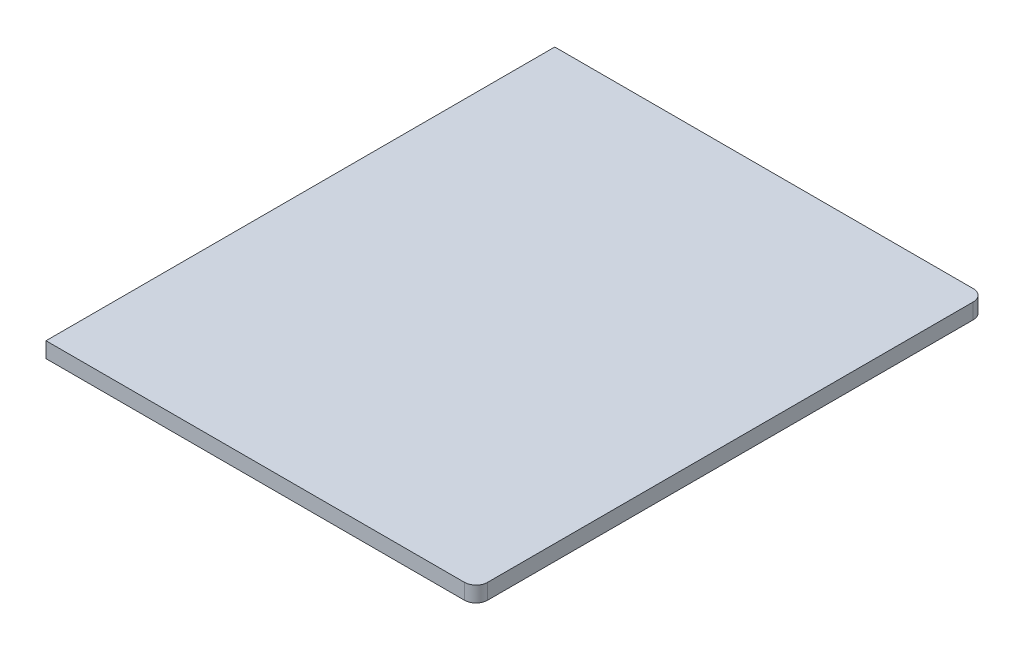
ISO-10303-21;
HEADER;
FILE_DESCRIPTION(('STEP AP214'),'2;1');
FILE_NAME('part.step','',(''),(''),'','','');
FILE_SCHEMA(('AUTOMOTIVE_DESIGN { 1 0 10303 214 1 1 1 1 }'));
ENDSEC;
DATA;
#1=APPLICATION_CONTEXT('core data for automotive mechanical design processes');
#2=APPLICATION_PROTOCOL_DEFINITION('international standard','automotive_design',2000,#1);
#3=PRODUCT_CONTEXT('',#1,'mechanical');
#4=PRODUCT('Part','Part','',(#3));
#5=PRODUCT_RELATED_PRODUCT_CATEGORY('part','',(#4));
#6=PRODUCT_DEFINITION_FORMATION('','',#4);
#7=PRODUCT_DEFINITION_CONTEXT('part definition',#1,'design');
#8=PRODUCT_DEFINITION('design','',#6,#7);
#9=PRODUCT_DEFINITION_SHAPE('','',#8);
#10=(LENGTH_UNIT() NAMED_UNIT(*) SI_UNIT(.MILLI.,.METRE.));
#11=(NAMED_UNIT(*) PLANE_ANGLE_UNIT() SI_UNIT($,.RADIAN.));
#12=(NAMED_UNIT(*) SI_UNIT($,.STERADIAN.) SOLID_ANGLE_UNIT());
#13=UNCERTAINTY_MEASURE_WITH_UNIT(LENGTH_MEASURE(1.E-05),#10,'distance_accuracy_value','');
#14=(GEOMETRIC_REPRESENTATION_CONTEXT(3) GLOBAL_UNCERTAINTY_ASSIGNED_CONTEXT((#13)) GLOBAL_UNIT_ASSIGNED_CONTEXT((#10,
#11,#12)) REPRESENTATION_CONTEXT('',''));
#15=CARTESIAN_POINT('',(0.,0.,0.));
#16=DIRECTION('',(0.,0.,1.));
#17=DIRECTION('',(1.,0.,0.));
#18=AXIS2_PLACEMENT_3D('',#15,#16,#17);
#19=CARTESIAN_POINT('',(0.,3.9,63.8297943852697));
#20=DIRECTION('',(0.,0.,-1.));
#21=DIRECTION('',(-1.,0.,0.));
#22=AXIS2_PLACEMENT_3D('',#19,#20,#21);
#23=PLANE('',#22);
#24=DIRECTION('',(1.,0.,0.));
#25=VECTOR('',#24,1.);
#26=CARTESIAN_POINT('',(0.,0.,63.8297943852697));
#27=LINE('',#26,#25);
#28=CARTESIAN_POINT('',(-110.,0.,63.8297943852697));
#29=VERTEX_POINT('',#28);
#30=CARTESIAN_POINT('',(-5.,0.,63.8297943852697));
#31=VERTEX_POINT('',#30);
#32=EDGE_CURVE('E135',#29,#31,#27,.T.);
#33=ORIENTED_EDGE('',*,*,#32,.T.);
#34=DIRECTION('',(0.,-1.,0.));
#35=VECTOR('',#34,1.);
#36=CARTESIAN_POINT('',(-5.,3.9,63.8297943852697));
#37=LINE('',#36,#35);
#38=CARTESIAN_POINT('',(-5.,3.9,63.8297943852697));
#39=VERTEX_POINT('',#38);
#40=EDGE_CURVE('E11',#39,#31,#37,.T.);
#41=ORIENTED_EDGE('',*,*,#40,.F.);
#42=DIRECTION('',(1.,0.,0.));
#43=VECTOR('',#42,1.);
#44=CARTESIAN_POINT('',(0.,3.9,63.8297943852697));
#45=LINE('',#44,#43);
#46=CARTESIAN_POINT('',(-110.,3.9,63.8297943852697));
#47=VERTEX_POINT('',#46);
#48=EDGE_CURVE('E153',#47,#39,#45,.T.);
#49=ORIENTED_EDGE('',*,*,#48,.F.);
#50=DIRECTION('',(0.,-1.,0.));
#51=VECTOR('',#50,1.);
#52=CARTESIAN_POINT('',(-110.,3.9,63.8297943852697));
#53=LINE('',#52,#51);
#54=EDGE_CURVE('E131',#47,#29,#53,.T.);
#55=ORIENTED_EDGE('',*,*,#54,.T.);
#56=EDGE_LOOP('',(#33,#41,#49,#55));
#57=FACE_BOUND('',#56,.T.);
#58=ADVANCED_FACE('F47',(#57),#23,.F.);
#59=CARTESIAN_POINT('',(-5.,3.9,60.9297943852697));
#60=DIRECTION('',(0.,-1.,0.));
#61=DIRECTION('',(0.,0.,-1.));
#62=AXIS2_PLACEMENT_3D('',#59,#60,#61);
#63=CYLINDRICAL_SURFACE('',#62,2.9);
#64=CARTESIAN_POINT('',(-5.,0.,60.9297943852697));
#65=DIRECTION('',(0.,1.,0.));
#66=DIRECTION('',(0.,0.,1.));
#67=AXIS2_PLACEMENT_3D('',#64,#65,#66);
#68=CIRCLE('',#67,2.9);
#69=CARTESIAN_POINT('',(-2.1,0.,60.9297943852697));
#70=VERTEX_POINT('',#69);
#71=EDGE_CURVE('E139',#31,#70,#68,.T.);
#72=ORIENTED_EDGE('',*,*,#71,.T.);
#73=DIRECTION('',(0.,-1.,0.));
#74=VECTOR('',#73,1.);
#75=CARTESIAN_POINT('',(-2.1,3.9,60.9297943852697));
#76=LINE('',#75,#74);
#77=CARTESIAN_POINT('',(-2.1,3.9,60.9297943852697));
#78=VERTEX_POINT('',#77);
#79=EDGE_CURVE('E56',#78,#70,#76,.T.);
#80=ORIENTED_EDGE('',*,*,#79,.F.);
#81=CARTESIAN_POINT('',(-5.,3.9,60.9297943852697));
#82=DIRECTION('',(0.,1.,0.));
#83=DIRECTION('',(0.,0.,1.));
#84=AXIS2_PLACEMENT_3D('',#81,#82,#83);
#85=CIRCLE('',#84,2.9);
#86=EDGE_CURVE('E97',#39,#78,#85,.T.);
#87=ORIENTED_EDGE('',*,*,#86,.F.);
#88=ORIENTED_EDGE('',*,*,#40,.T.);
#89=EDGE_LOOP('',(#72,#80,#87,#88));
#90=FACE_BOUND('',#89,.T.);
#91=ADVANCED_FACE('F181',(#90),#63,.T.);
#92=CARTESIAN_POINT('',(-2.1,3.9,0.));
#93=DIRECTION('',(-1.,0.,0.));
#94=DIRECTION('',(0.,0.,1.));
#95=AXIS2_PLACEMENT_3D('',#92,#93,#94);
#96=PLANE('',#95);
#97=DIRECTION('',(0.,0.,-1.));
#98=VECTOR('',#97,1.);
#99=CARTESIAN_POINT('',(-2.1,0.,0.));
#100=LINE('',#99,#98);
#101=CARTESIAN_POINT('',(-2.1,0.,-60.9297943852697));
#102=VERTEX_POINT('',#101);
#103=EDGE_CURVE('E143',#70,#102,#100,.T.);
#104=ORIENTED_EDGE('',*,*,#103,.T.);
#105=DIRECTION('',(0.,-1.,0.));
#106=VECTOR('',#105,1.);
#107=CARTESIAN_POINT('',(-2.1,3.9,-60.9297943852697));
#108=LINE('',#107,#106);
#109=CARTESIAN_POINT('',(-2.1,3.9,-60.9297943852697));
#110=VERTEX_POINT('',#109);
#111=EDGE_CURVE('E125',#110,#102,#108,.T.);
#112=ORIENTED_EDGE('',*,*,#111,.F.);
#113=DIRECTION('',(0.,0.,-1.));
#114=VECTOR('',#113,1.);
#115=CARTESIAN_POINT('',(-2.1,3.9,0.));
#116=LINE('',#115,#114);
#117=EDGE_CURVE('E110',#78,#110,#116,.T.);
#118=ORIENTED_EDGE('',*,*,#117,.F.);
#119=ORIENTED_EDGE('',*,*,#79,.T.);
#120=EDGE_LOOP('',(#104,#112,#118,#119));
#121=FACE_BOUND('',#120,.T.);
#122=ADVANCED_FACE('F163',(#121),#96,.F.);
#123=CARTESIAN_POINT('',(-5.,3.9,-60.9297943852697));
#124=DIRECTION('',(0.,-1.,0.));
#125=DIRECTION('',(0.,0.,-1.));
#126=AXIS2_PLACEMENT_3D('',#123,#124,#125);
#127=CYLINDRICAL_SURFACE('',#126,2.90000000000001);
#128=CARTESIAN_POINT('',(-5.,0.,-60.9297943852697));
#129=DIRECTION('',(0.,1.,0.));
#130=DIRECTION('',(0.,0.,1.));
#131=AXIS2_PLACEMENT_3D('',#128,#129,#130);
#132=CIRCLE('',#131,2.90000000000001);
#133=CARTESIAN_POINT('',(-5.,0.,-63.8297943852697));
#134=VERTEX_POINT('',#133);
#135=EDGE_CURVE('E120',#102,#134,#132,.T.);
#136=ORIENTED_EDGE('',*,*,#135,.T.);
#137=DIRECTION('',(0.,-1.,0.));
#138=VECTOR('',#137,1.);
#139=CARTESIAN_POINT('',(-5.,3.9,-63.8297943852697));
#140=LINE('',#139,#138);
#141=CARTESIAN_POINT('',(-5.,3.9,-63.8297943852697));
#142=VERTEX_POINT('',#141);
#143=EDGE_CURVE('E117',#142,#134,#140,.T.);
#144=ORIENTED_EDGE('',*,*,#143,.F.);
#145=CARTESIAN_POINT('',(-5.,3.9,-60.9297943852697));
#146=DIRECTION('',(0.,1.,0.));
#147=DIRECTION('',(0.,0.,1.));
#148=AXIS2_PLACEMENT_3D('',#145,#146,#147);
#149=CIRCLE('',#148,2.90000000000001);
#150=EDGE_CURVE('E104',#110,#142,#149,.T.);
#151=ORIENTED_EDGE('',*,*,#150,.F.);
#152=ORIENTED_EDGE('',*,*,#111,.T.);
#153=EDGE_LOOP('',(#136,#144,#151,#152));
#154=FACE_BOUND('',#153,.T.);
#155=ADVANCED_FACE('F118',(#154),#127,.T.);
#156=CARTESIAN_POINT('',(0.,3.9,-63.8297943852697));
#157=DIRECTION('',(0.,0.,-1.));
#158=DIRECTION('',(-1.,0.,0.));
#159=AXIS2_PLACEMENT_3D('',#156,#157,#158);
#160=PLANE('',#159);
#161=DIRECTION('',(1.,0.,0.));
#162=VECTOR('',#161,1.);
#163=CARTESIAN_POINT('',(0.,0.,-63.8297943852697));
#164=LINE('',#163,#162);
#165=CARTESIAN_POINT('',(-110.,0.,-63.8297943852697));
#166=VERTEX_POINT('',#165);
#167=EDGE_CURVE('E148',#166,#134,#164,.T.);
#168=ORIENTED_EDGE('',*,*,#167,.F.);
#169=DIRECTION('',(0.,-1.,0.));
#170=VECTOR('',#169,1.);
#171=CARTESIAN_POINT('',(-110.,3.9,-63.8297943852697));
#172=LINE('',#171,#170);
#173=CARTESIAN_POINT('',(-110.,3.9,-63.8297943852697));
#174=VERTEX_POINT('',#173);
#175=EDGE_CURVE('E86',#174,#166,#172,.T.);
#176=ORIENTED_EDGE('',*,*,#175,.F.);
#177=DIRECTION('',(1.,0.,0.));
#178=VECTOR('',#177,1.);
#179=CARTESIAN_POINT('',(0.,3.9,-63.8297943852697));
#180=LINE('',#179,#178);
#181=EDGE_CURVE('E108',#174,#142,#180,.T.);
#182=ORIENTED_EDGE('',*,*,#181,.T.);
#183=ORIENTED_EDGE('',*,*,#143,.T.);
#184=EDGE_LOOP('',(#168,#176,#182,#183));
#185=FACE_BOUND('',#184,.T.);
#186=ADVANCED_FACE('F127',(#185),#160,.T.);
#187=CARTESIAN_POINT('',(-110.,3.9,0.));
#188=DIRECTION('',(1.,0.,0.));
#189=DIRECTION('',(0.,0.,-1.));
#190=AXIS2_PLACEMENT_3D('',#187,#188,#189);
#191=PLANE('',#190);
#192=DIRECTION('',(0.,0.,1.));
#193=VECTOR('',#192,1.);
#194=CARTESIAN_POINT('',(-110.,0.,0.));
#195=LINE('',#194,#193);
#196=EDGE_CURVE('E89',#166,#29,#195,.T.);
#197=ORIENTED_EDGE('',*,*,#196,.T.);
#198=ORIENTED_EDGE('',*,*,#54,.F.);
#199=DIRECTION('',(0.,0.,1.));
#200=VECTOR('',#199,1.);
#201=CARTESIAN_POINT('',(-110.,3.9,0.));
#202=LINE('',#201,#200);
#203=EDGE_CURVE('E64',#174,#47,#202,.T.);
#204=ORIENTED_EDGE('',*,*,#203,.F.);
#205=ORIENTED_EDGE('',*,*,#175,.T.);
#206=EDGE_LOOP('',(#197,#198,#204,#205));
#207=FACE_BOUND('',#206,.T.);
#208=ADVANCED_FACE('F170',(#207),#191,.F.);
#209=CARTESIAN_POINT('',(0.,3.9,0.));
#210=DIRECTION('',(0.,1.,0.));
#211=DIRECTION('',(0.,0.,1.));
#212=AXIS2_PLACEMENT_3D('',#209,#210,#211);
#213=PLANE('',#212);
#214=ORIENTED_EDGE('',*,*,#48,.T.);
#215=ORIENTED_EDGE('',*,*,#86,.T.);
#216=ORIENTED_EDGE('',*,*,#117,.T.);
#217=ORIENTED_EDGE('',*,*,#150,.T.);
#218=ORIENTED_EDGE('',*,*,#181,.F.);
#219=ORIENTED_EDGE('',*,*,#203,.T.);
#220=EDGE_LOOP('',(#214,#215,#216,#217,#218,#219));
#221=FACE_BOUND('',#220,.T.);
#222=ADVANCED_FACE('F106',(#221),#213,.T.);
#223=CARTESIAN_POINT('',(0.,0.,0.));
#224=DIRECTION('',(0.,1.,0.));
#225=DIRECTION('',(0.,0.,1.));
#226=AXIS2_PLACEMENT_3D('',#223,#224,#225);
#227=PLANE('',#226);
#228=CARTESIAN_POINT('',(-5.,0.,60.9297943852697));
#229=DIRECTION('',(0.,1.,0.));
#230=DIRECTION('',(0.,0.,1.));
#231=AXIS2_PLACEMENT_3D('',#228,#229,#230);
#232=CIRCLE('',#231,2.1);
#233=CARTESIAN_POINT('',(-5.,0.,63.0297943852697));
#234=VERTEX_POINT('',#233);
#235=EDGE_CURVE('E343',#234,#234,#232,.T.);
#236=ORIENTED_EDGE('',*,*,#235,.T.);
#237=EDGE_LOOP('',(#236));
#238=FACE_BOUND('',#237,.T.);
#239=CARTESIAN_POINT('',(-107.,0.,-60.9297943852697));
#240=DIRECTION('',(0.,1.,0.));
#241=DIRECTION('',(0.,0.,1.));
#242=AXIS2_PLACEMENT_3D('',#239,#240,#241);
#243=CIRCLE('',#242,2.1);
#244=CARTESIAN_POINT('',(-107.,0.,-58.8297943852697));
#245=VERTEX_POINT('',#244);
#246=EDGE_CURVE('E359',#245,#245,#243,.T.);
#247=ORIENTED_EDGE('',*,*,#246,.T.);
#248=EDGE_LOOP('',(#247));
#249=FACE_BOUND('',#248,.T.);
#250=CARTESIAN_POINT('',(-107.,0.,60.9297943852697));
#251=DIRECTION('',(0.,1.,0.));
#252=DIRECTION('',(0.,0.,1.));
#253=AXIS2_PLACEMENT_3D('',#250,#251,#252);
#254=CIRCLE('',#253,2.1);
#255=CARTESIAN_POINT('',(-107.,0.,63.0297943852697));
#256=VERTEX_POINT('',#255);
#257=EDGE_CURVE('E353',#256,#256,#254,.T.);
#258=ORIENTED_EDGE('',*,*,#257,.T.);
#259=EDGE_LOOP('',(#258));
#260=FACE_BOUND('',#259,.T.);
#261=CARTESIAN_POINT('',(-5.,0.,-60.9297943852697));
#262=DIRECTION('',(0.,1.,0.));
#263=DIRECTION('',(0.,0.,1.));
#264=AXIS2_PLACEMENT_3D('',#261,#262,#263);
#265=CIRCLE('',#264,2.1);
#266=CARTESIAN_POINT('',(-5.,0.,-58.8297943852697));
#267=VERTEX_POINT('',#266);
#268=EDGE_CURVE('E342',#267,#267,#265,.T.);
#269=ORIENTED_EDGE('',*,*,#268,.T.);
#270=EDGE_LOOP('',(#269));
#271=FACE_BOUND('',#270,.T.);
#272=ORIENTED_EDGE('',*,*,#32,.F.);
#273=ORIENTED_EDGE('',*,*,#196,.F.);
#274=ORIENTED_EDGE('',*,*,#167,.T.);
#275=ORIENTED_EDGE('',*,*,#135,.F.);
#276=ORIENTED_EDGE('',*,*,#103,.F.);
#277=ORIENTED_EDGE('',*,*,#71,.F.);
#278=EDGE_LOOP('',(#272,#273,#274,#275,#276,#277));
#279=FACE_BOUND('',#278,.T.);
#280=ADVANCED_FACE('F166',(#238,#249,#260,#271,#279),#227,.F.);
#281=CARTESIAN_POINT('',(-5.,1.6,-60.9297943852697));
#282=DIRECTION('',(0.,-1.,0.));
#283=DIRECTION('',(0.,0.,-1.));
#284=AXIS2_PLACEMENT_3D('',#281,#282,#283);
#285=CYLINDRICAL_SURFACE('',#284,2.1);
#286=CARTESIAN_POINT('',(-5.,1.6,-60.9297943852697));
#287=DIRECTION('',(0.,1.,0.));
#288=DIRECTION('',(0.,0.,1.));
#289=AXIS2_PLACEMENT_3D('',#286,#287,#288);
#290=CIRCLE('',#289,2.1);
#291=CARTESIAN_POINT('',(-5.,1.6,-58.8297943852697));
#292=VERTEX_POINT('',#291);
#293=EDGE_CURVE('E140',#292,#292,#290,.T.);
#294=ORIENTED_EDGE('',*,*,#293,.T.);
#295=EDGE_LOOP('',(#294));
#296=FACE_BOUND('',#295,.T.);
#297=ORIENTED_EDGE('',*,*,#268,.F.);
#298=EDGE_LOOP('',(#297));
#299=FACE_BOUND('',#298,.T.);
#300=ADVANCED_FACE('F238',(#296,#299),#285,.F.);
#301=CARTESIAN_POINT('',(0.,1.6,0.));
#302=DIRECTION('',(0.,1.,0.));
#303=DIRECTION('',(0.,0.,1.));
#304=AXIS2_PLACEMENT_3D('',#301,#302,#303);
#305=PLANE('',#304);
#306=ORIENTED_EDGE('',*,*,#293,.F.);
#307=EDGE_LOOP('',(#306));
#308=FACE_BOUND('',#307,.T.);
#309=ADVANCED_FACE('F265',(#308),#305,.F.);
#310=CARTESIAN_POINT('',(-107.,1.6,60.9297943852697));
#311=DIRECTION('',(0.,-1.,0.));
#312=DIRECTION('',(0.,0.,-1.));
#313=AXIS2_PLACEMENT_3D('',#310,#311,#312);
#314=CYLINDRICAL_SURFACE('',#313,2.1);
#315=CARTESIAN_POINT('',(-107.,1.6,60.9297943852697));
#316=DIRECTION('',(0.,1.,0.));
#317=DIRECTION('',(0.,0.,1.));
#318=AXIS2_PLACEMENT_3D('',#315,#316,#317);
#319=CIRCLE('',#318,2.1);
#320=CARTESIAN_POINT('',(-107.,1.6,63.0297943852697));
#321=VERTEX_POINT('',#320);
#322=EDGE_CURVE('E363',#321,#321,#319,.T.);
#323=ORIENTED_EDGE('',*,*,#322,.T.);
#324=EDGE_LOOP('',(#323));
#325=FACE_BOUND('',#324,.T.);
#326=ORIENTED_EDGE('',*,*,#257,.F.);
#327=EDGE_LOOP('',(#326));
#328=FACE_BOUND('',#327,.T.);
#329=ADVANCED_FACE('F275',(#325,#328),#314,.F.);
#330=CARTESIAN_POINT('',(0.,1.6,0.));
#331=DIRECTION('',(0.,1.,0.));
#332=DIRECTION('',(0.,0.,1.));
#333=AXIS2_PLACEMENT_3D('',#330,#331,#332);
#334=PLANE('',#333);
#335=ORIENTED_EDGE('',*,*,#322,.F.);
#336=EDGE_LOOP('',(#335));
#337=FACE_BOUND('',#336,.T.);
#338=ADVANCED_FACE('F285',(#337),#334,.F.);
#339=CARTESIAN_POINT('',(-107.,1.6,-60.9297943852697));
#340=DIRECTION('',(0.,-1.,0.));
#341=DIRECTION('',(0.,0.,-1.));
#342=AXIS2_PLACEMENT_3D('',#339,#340,#341);
#343=CYLINDRICAL_SURFACE('',#342,2.1);
#344=CARTESIAN_POINT('',(-107.,1.6,-60.9297943852697));
#345=DIRECTION('',(0.,1.,0.));
#346=DIRECTION('',(0.,0.,1.));
#347=AXIS2_PLACEMENT_3D('',#344,#345,#346);
#348=CIRCLE('',#347,2.1);
#349=CARTESIAN_POINT('',(-107.,1.6,-58.8297943852697));
#350=VERTEX_POINT('',#349);
#351=EDGE_CURVE('E350',#350,#350,#348,.T.);
#352=ORIENTED_EDGE('',*,*,#351,.T.);
#353=EDGE_LOOP('',(#352));
#354=FACE_BOUND('',#353,.T.);
#355=ORIENTED_EDGE('',*,*,#246,.F.);
#356=EDGE_LOOP('',(#355));
#357=FACE_BOUND('',#356,.T.);
#358=ADVANCED_FACE('F295',(#354,#357),#343,.F.);
#359=CARTESIAN_POINT('',(0.,1.6,0.));
#360=DIRECTION('',(0.,1.,0.));
#361=DIRECTION('',(0.,0.,1.));
#362=AXIS2_PLACEMENT_3D('',#359,#360,#361);
#363=PLANE('',#362);
#364=ORIENTED_EDGE('',*,*,#351,.F.);
#365=EDGE_LOOP('',(#364));
#366=FACE_BOUND('',#365,.T.);
#367=ADVANCED_FACE('F305',(#366),#363,.F.);
#368=CARTESIAN_POINT('',(-5.,1.6,60.9297943852697));
#369=DIRECTION('',(0.,-1.,0.));
#370=DIRECTION('',(0.,0.,-1.));
#371=AXIS2_PLACEMENT_3D('',#368,#369,#370);
#372=CYLINDRICAL_SURFACE('',#371,2.1);
#373=CARTESIAN_POINT('',(-5.,1.6,60.9297943852697));
#374=DIRECTION('',(0.,1.,0.));
#375=DIRECTION('',(0.,0.,1.));
#376=AXIS2_PLACEMENT_3D('',#373,#374,#375);
#377=CIRCLE('',#376,2.1);
#378=CARTESIAN_POINT('',(-5.,1.6,63.0297943852697));
#379=VERTEX_POINT('',#378);
#380=EDGE_CURVE('E340',#379,#379,#377,.T.);
#381=ORIENTED_EDGE('',*,*,#380,.T.);
#382=EDGE_LOOP('',(#381));
#383=FACE_BOUND('',#382,.T.);
#384=ORIENTED_EDGE('',*,*,#235,.F.);
#385=EDGE_LOOP('',(#384));
#386=FACE_BOUND('',#385,.T.);
#387=ADVANCED_FACE('F315',(#383,#386),#372,.F.);
#388=CARTESIAN_POINT('',(0.,1.6,0.));
#389=DIRECTION('',(0.,1.,0.));
#390=DIRECTION('',(0.,0.,1.));
#391=AXIS2_PLACEMENT_3D('',#388,#389,#390);
#392=PLANE('',#391);
#393=ORIENTED_EDGE('',*,*,#380,.F.);
#394=EDGE_LOOP('',(#393));
#395=FACE_BOUND('',#394,.T.);
#396=ADVANCED_FACE('F325',(#395),#392,.F.);
#397=CLOSED_SHELL('',(#58,#91,#122,#155,#186,#208,#222,#280,#300,#309,#329,#338,#358,#367,#387,#396));
#398=MANIFOLD_SOLID_BREP('B2',#397);
#399=ADVANCED_BREP_SHAPE_REPRESENTATION('',(#18,#398),#14);
#400=SHAPE_DEFINITION_REPRESENTATION(#9,#399);
ENDSEC;
END-ISO-10303-21;
